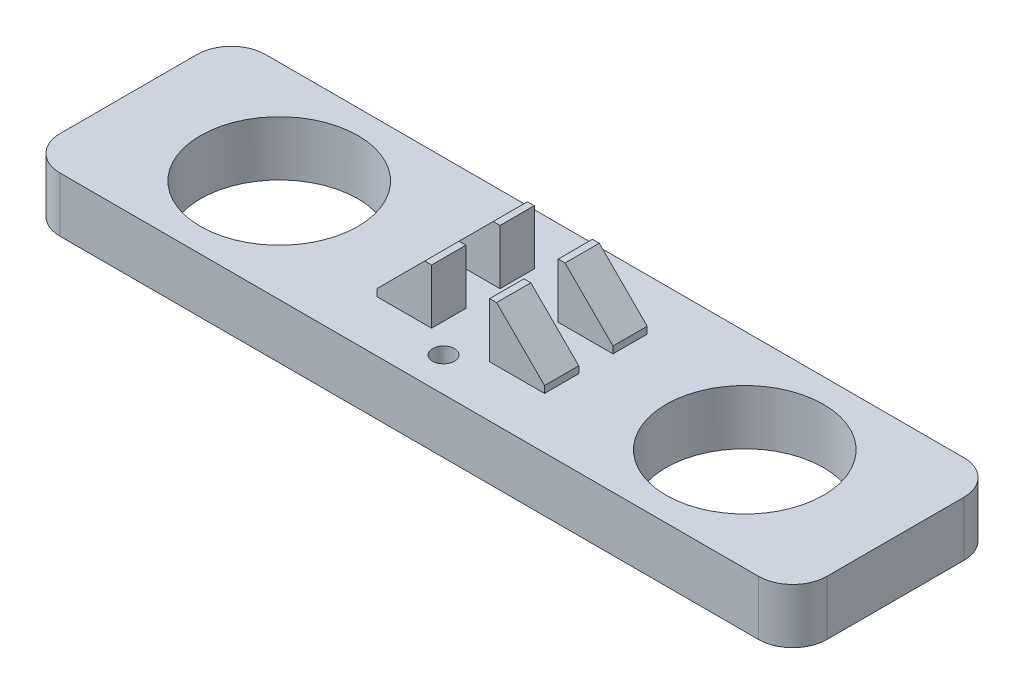
ISO-10303-21;
HEADER;
FILE_DESCRIPTION(('STEP AP214'),'2;1');
FILE_NAME('part.step','',(''),(''),'','','');
FILE_SCHEMA(('AUTOMOTIVE_DESIGN { 1 0 10303 214 1 1 1 1 }'));
ENDSEC;
DATA;
#1=APPLICATION_CONTEXT('core data for automotive mechanical design processes');
#2=APPLICATION_PROTOCOL_DEFINITION('international standard','automotive_design',2000,#1);
#3=PRODUCT_CONTEXT('',#1,'mechanical');
#4=PRODUCT('Part','Part','',(#3));
#5=PRODUCT_RELATED_PRODUCT_CATEGORY('part','',(#4));
#6=PRODUCT_DEFINITION_FORMATION('','',#4);
#7=PRODUCT_DEFINITION_CONTEXT('part definition',#1,'design');
#8=PRODUCT_DEFINITION('design','',#6,#7);
#9=PRODUCT_DEFINITION_SHAPE('','',#8);
#10=(LENGTH_UNIT() NAMED_UNIT(*) SI_UNIT(.MILLI.,.METRE.));
#11=(NAMED_UNIT(*) PLANE_ANGLE_UNIT() SI_UNIT($,.RADIAN.));
#12=(NAMED_UNIT(*) SI_UNIT($,.STERADIAN.) SOLID_ANGLE_UNIT());
#13=UNCERTAINTY_MEASURE_WITH_UNIT(LENGTH_MEASURE(1.E-05),#10,'distance_accuracy_value','');
#14=(GEOMETRIC_REPRESENTATION_CONTEXT(3) GLOBAL_UNCERTAINTY_ASSIGNED_CONTEXT((#13)) GLOBAL_UNIT_ASSIGNED_CONTEXT((#10,
#11,#12)) REPRESENTATION_CONTEXT('',''));
#15=CARTESIAN_POINT('',(0.,0.,0.));
#16=DIRECTION('',(0.,0.,1.));
#17=DIRECTION('',(1.,0.,0.));
#18=AXIS2_PLACEMENT_3D('',#15,#16,#17);
#19=CARTESIAN_POINT('',(0.,5.,0.));
#20=DIRECTION('',(0.,-1.,0.));
#21=DIRECTION('',(0.,0.,-1.));
#22=AXIS2_PLACEMENT_3D('',#19,#20,#21);
#23=PLANE('',#22);
#24=DIRECTION('',(-1.,0.,0.));
#25=VECTOR('',#24,1.);
#26=CARTESIAN_POINT('',(60.25,5.,-7.5));
#27=LINE('',#26,#25);
#28=CARTESIAN_POINT('',(68.25,5.,-7.5));
#29=VERTEX_POINT('',#28);
#30=CARTESIAN_POINT('',(60.25,5.,-7.5));
#31=VERTEX_POINT('',#30);
#32=EDGE_CURVE('E256',#29,#31,#27,.T.);
#33=ORIENTED_EDGE('',*,*,#32,.T.);
#34=DIRECTION('',(0.,0.,-1.));
#35=VECTOR('',#34,1.);
#36=CARTESIAN_POINT('',(60.25,5.,-7.5));
#37=LINE('',#36,#35);
#38=CARTESIAN_POINT('',(60.25,5.,-12.5));
#39=VERTEX_POINT('',#38);
#40=EDGE_CURVE('E240',#31,#39,#37,.T.);
#41=ORIENTED_EDGE('',*,*,#40,.T.);
#42=DIRECTION('',(1.,0.,0.));
#43=VECTOR('',#42,1.);
#44=CARTESIAN_POINT('',(60.25,5.,-12.5));
#45=LINE('',#44,#43);
#46=CARTESIAN_POINT('',(68.25,5.,-12.5));
#47=VERTEX_POINT('',#46);
#48=EDGE_CURVE('E247',#39,#47,#45,.T.);
#49=ORIENTED_EDGE('',*,*,#48,.T.);
#50=DIRECTION('',(0.,0.,1.));
#51=VECTOR('',#50,1.);
#52=CARTESIAN_POINT('',(68.25,5.,-7.5));
#53=LINE('',#52,#51);
#54=EDGE_CURVE('E250',#47,#29,#53,.T.);
#55=ORIENTED_EDGE('',*,*,#54,.T.);
#56=EDGE_LOOP('',(#33,#41,#49,#55));
#57=FACE_BOUND('',#56,.T.);
#58=DIRECTION('',(-1.,0.,0.));
#59=VECTOR('',#58,1.);
#60=CARTESIAN_POINT('',(43.75,5.,-7.5));
#61=LINE('',#60,#59);
#62=CARTESIAN_POINT('',(51.75,5.,-7.5));
#63=VERTEX_POINT('',#62);
#64=CARTESIAN_POINT('',(43.75,5.,-7.5));
#65=VERTEX_POINT('',#64);
#66=EDGE_CURVE('E275',#63,#65,#61,.T.);
#67=ORIENTED_EDGE('',*,*,#66,.T.);
#68=DIRECTION('',(0.,0.,-1.));
#69=VECTOR('',#68,1.);
#70=CARTESIAN_POINT('',(43.75,5.,-7.5));
#71=LINE('',#70,#69);
#72=CARTESIAN_POINT('',(43.75,5.,-12.5));
#73=VERTEX_POINT('',#72);
#74=EDGE_CURVE('E242',#65,#73,#71,.T.);
#75=ORIENTED_EDGE('',*,*,#74,.T.);
#76=DIRECTION('',(1.,0.,0.));
#77=VECTOR('',#76,1.);
#78=CARTESIAN_POINT('',(43.75,5.,-12.5));
#79=LINE('',#78,#77);
#80=CARTESIAN_POINT('',(51.75,5.,-12.5));
#81=VERTEX_POINT('',#80);
#82=EDGE_CURVE('E267',#73,#81,#79,.T.);
#83=ORIENTED_EDGE('',*,*,#82,.T.);
#84=DIRECTION('',(0.,0.,1.));
#85=VECTOR('',#84,1.);
#86=CARTESIAN_POINT('',(51.75,5.,-7.5));
#87=LINE('',#86,#85);
#88=EDGE_CURVE('E278',#81,#63,#87,.T.);
#89=ORIENTED_EDGE('',*,*,#88,.T.);
#90=EDGE_LOOP('',(#67,#75,#83,#89));
#91=FACE_BOUND('',#90,.T.);
#92=DIRECTION('',(0.,0.,1.));
#93=VECTOR('',#92,1.);
#94=CARTESIAN_POINT('',(43.75,5.,-22.5));
#95=LINE('',#94,#93);
#96=CARTESIAN_POINT('',(43.75,5.,-22.5));
#97=VERTEX_POINT('',#96);
#98=CARTESIAN_POINT('',(43.75,5.,-17.5));
#99=VERTEX_POINT('',#98);
#100=EDGE_CURVE('E321',#97,#99,#95,.T.);
#101=ORIENTED_EDGE('',*,*,#100,.F.);
#102=DIRECTION('',(-1.,0.,0.));
#103=VECTOR('',#102,1.);
#104=CARTESIAN_POINT('',(43.75,5.,-22.5));
#105=LINE('',#104,#103);
#106=CARTESIAN_POINT('',(51.75,5.,-22.5));
#107=VERTEX_POINT('',#106);
#108=EDGE_CURVE('E325',#107,#97,#105,.T.);
#109=ORIENTED_EDGE('',*,*,#108,.F.);
#110=DIRECTION('',(0.,0.,-1.));
#111=VECTOR('',#110,1.);
#112=CARTESIAN_POINT('',(51.75,5.,-22.5));
#113=LINE('',#112,#111);
#114=CARTESIAN_POINT('',(51.75,5.,-17.5));
#115=VERTEX_POINT('',#114);
#116=EDGE_CURVE('E336',#115,#107,#113,.T.);
#117=ORIENTED_EDGE('',*,*,#116,.F.);
#118=DIRECTION('',(1.,0.,0.));
#119=VECTOR('',#118,1.);
#120=CARTESIAN_POINT('',(43.75,5.,-17.5));
#121=LINE('',#120,#119);
#122=EDGE_CURVE('E333',#99,#115,#121,.T.);
#123=ORIENTED_EDGE('',*,*,#122,.F.);
#124=EDGE_LOOP('',(#101,#109,#117,#123));
#125=FACE_BOUND('',#124,.T.);
#126=CARTESIAN_POINT('',(56.,5.,-25.));
#127=DIRECTION('',(0.,-1.,0.));
#128=DIRECTION('',(0.,0.,1.));
#129=AXIS2_PLACEMENT_3D('',#126,#127,#128);
#130=CIRCLE('',#129,1.6);
#131=CARTESIAN_POINT('',(56.,5.,-23.4));
#132=VERTEX_POINT('',#131);
#133=EDGE_CURVE('E363',#132,#132,#130,.T.);
#134=ORIENTED_EDGE('',*,*,#133,.T.);
#135=EDGE_LOOP('',(#134));
#136=FACE_BOUND('',#135,.T.);
#137=CARTESIAN_POINT('',(56.,5.,-5.));
#138=DIRECTION('',(0.,-1.,0.));
#139=DIRECTION('',(0.,0.,1.));
#140=AXIS2_PLACEMENT_3D('',#137,#138,#139);
#141=CIRCLE('',#140,1.6);
#142=CARTESIAN_POINT('',(56.,5.,-3.4));
#143=VERTEX_POINT('',#142);
#144=EDGE_CURVE('E362',#143,#143,#141,.T.);
#145=ORIENTED_EDGE('',*,*,#144,.T.);
#146=EDGE_LOOP('',(#145));
#147=FACE_BOUND('',#146,.T.);
#148=DIRECTION('',(1.,0.,0.));
#149=VECTOR('',#148,1.);
#150=CARTESIAN_POINT('',(0.,5.,0.));
#151=LINE('',#150,#149);
#152=CARTESIAN_POINT('',(5.,5.,0.));
#153=VERTEX_POINT('',#152);
#154=CARTESIAN_POINT('',(107.,5.,0.));
#155=VERTEX_POINT('',#154);
#156=EDGE_CURVE('E402',#153,#155,#151,.T.);
#157=ORIENTED_EDGE('',*,*,#156,.T.);
#158=CARTESIAN_POINT('',(107.,5.,-5.));
#159=DIRECTION('',(0.,-1.,0.));
#160=DIRECTION('',(0.,0.,-1.));
#161=AXIS2_PLACEMENT_3D('',#158,#159,#160);
#162=CIRCLE('',#161,5.);
#163=CARTESIAN_POINT('',(112.,5.,-5.));
#164=VERTEX_POINT('',#163);
#165=EDGE_CURVE('E429',#155,#164,#162,.F.);
#166=ORIENTED_EDGE('',*,*,#165,.T.);
#167=DIRECTION('',(0.,0.,1.));
#168=VECTOR('',#167,1.);
#169=CARTESIAN_POINT('',(112.,5.,0.));
#170=LINE('',#169,#168);
#171=CARTESIAN_POINT('',(112.,5.,-25.));
#172=VERTEX_POINT('',#171);
#173=EDGE_CURVE('E371',#172,#164,#170,.T.);
#174=ORIENTED_EDGE('',*,*,#173,.F.);
#175=CARTESIAN_POINT('',(107.,5.,-25.));
#176=DIRECTION('',(0.,-1.,0.));
#177=DIRECTION('',(0.,0.,-1.));
#178=AXIS2_PLACEMENT_3D('',#175,#176,#177);
#179=CIRCLE('',#178,5.);
#180=CARTESIAN_POINT('',(107.,5.,-30.));
#181=VERTEX_POINT('',#180);
#182=EDGE_CURVE('E427',#172,#181,#179,.F.);
#183=ORIENTED_EDGE('',*,*,#182,.T.);
#184=DIRECTION('',(-1.,0.,0.));
#185=VECTOR('',#184,1.);
#186=CARTESIAN_POINT('',(0.,5.,-30.));
#187=LINE('',#186,#185);
#188=CARTESIAN_POINT('',(5.,5.,-30.));
#189=VERTEX_POINT('',#188);
#190=EDGE_CURVE('E405',#181,#189,#187,.T.);
#191=ORIENTED_EDGE('',*,*,#190,.T.);
#192=CARTESIAN_POINT('',(5.,5.,-25.));
#193=DIRECTION('',(0.,-1.,0.));
#194=DIRECTION('',(0.,0.,-1.));
#195=AXIS2_PLACEMENT_3D('',#192,#193,#194);
#196=CIRCLE('',#195,5.);
#197=CARTESIAN_POINT('',(0.,5.,-25.));
#198=VERTEX_POINT('',#197);
#199=EDGE_CURVE('E414',#189,#198,#196,.F.);
#200=ORIENTED_EDGE('',*,*,#199,.T.);
#201=DIRECTION('',(0.,0.,1.));
#202=VECTOR('',#201,1.);
#203=CARTESIAN_POINT('',(0.,5.,0.));
#204=LINE('',#203,#202);
#205=CARTESIAN_POINT('',(0.,5.,-5.));
#206=VERTEX_POINT('',#205);
#207=EDGE_CURVE('E399',#198,#206,#204,.T.);
#208=ORIENTED_EDGE('',*,*,#207,.T.);
#209=CARTESIAN_POINT('',(5.,5.,-5.));
#210=DIRECTION('',(0.,-1.,0.));
#211=DIRECTION('',(0.,0.,-1.));
#212=AXIS2_PLACEMENT_3D('',#209,#210,#211);
#213=CIRCLE('',#212,5.);
#214=EDGE_CURVE('E416',#206,#153,#213,.F.);
#215=ORIENTED_EDGE('',*,*,#214,.T.);
#216=EDGE_LOOP('',(#157,#166,#174,#183,#191,#200,#208,#215));
#217=FACE_BOUND('',#216,.T.);
#218=CARTESIAN_POINT('',(22.,5.,-15.));
#219=DIRECTION('',(0.,1.,0.));
#220=DIRECTION('',(0.,0.,1.));
#221=AXIS2_PLACEMENT_3D('',#218,#219,#220);
#222=CIRCLE('',#221,11.5);
#223=CARTESIAN_POINT('',(22.,5.,-3.5));
#224=VERTEX_POINT('',#223);
#225=EDGE_CURVE('E396',#224,#224,#222,.T.);
#226=ORIENTED_EDGE('',*,*,#225,.F.);
#227=EDGE_LOOP('',(#226));
#228=FACE_BOUND('',#227,.T.);
#229=CARTESIAN_POINT('',(90.,5.,-15.));
#230=DIRECTION('',(0.,-1.,0.));
#231=DIRECTION('',(0.,0.,1.));
#232=AXIS2_PLACEMENT_3D('',#229,#230,#231);
#233=CIRCLE('',#232,11.5);
#234=CARTESIAN_POINT('',(90.,5.,-3.5));
#235=VERTEX_POINT('',#234);
#236=EDGE_CURVE('E366',#235,#235,#233,.T.);
#237=ORIENTED_EDGE('',*,*,#236,.T.);
#238=EDGE_LOOP('',(#237));
#239=FACE_BOUND('',#238,.T.);
#240=DIRECTION('',(0.,0.,1.));
#241=VECTOR('',#240,1.);
#242=CARTESIAN_POINT('',(60.25,5.,-22.5));
#243=LINE('',#242,#241);
#244=CARTESIAN_POINT('',(60.25,5.,-22.5));
#245=VERTEX_POINT('',#244);
#246=CARTESIAN_POINT('',(60.25,5.,-17.5));
#247=VERTEX_POINT('',#246);
#248=EDGE_CURVE('E291',#245,#247,#243,.T.);
#249=ORIENTED_EDGE('',*,*,#248,.F.);
#250=DIRECTION('',(-1.,0.,0.));
#251=VECTOR('',#250,1.);
#252=CARTESIAN_POINT('',(60.25,5.,-22.5));
#253=LINE('',#252,#251);
#254=CARTESIAN_POINT('',(68.25,5.,-22.5));
#255=VERTEX_POINT('',#254);
#256=EDGE_CURVE('E296',#255,#245,#253,.T.);
#257=ORIENTED_EDGE('',*,*,#256,.F.);
#258=DIRECTION('',(0.,0.,-1.));
#259=VECTOR('',#258,1.);
#260=CARTESIAN_POINT('',(68.25,5.,-22.5));
#261=LINE('',#260,#259);
#262=CARTESIAN_POINT('',(68.25,5.,-17.5));
#263=VERTEX_POINT('',#262);
#264=EDGE_CURVE('E307',#263,#255,#261,.T.);
#265=ORIENTED_EDGE('',*,*,#264,.F.);
#266=DIRECTION('',(1.,0.,0.));
#267=VECTOR('',#266,1.);
#268=CARTESIAN_POINT('',(60.25,5.,-17.5));
#269=LINE('',#268,#267);
#270=EDGE_CURVE('E304',#247,#263,#269,.T.);
#271=ORIENTED_EDGE('',*,*,#270,.F.);
#272=EDGE_LOOP('',(#249,#257,#265,#271));
#273=FACE_BOUND('',#272,.T.);
#274=ADVANCED_FACE('F37',(#57,#91,#125,#136,#147,#217,#228,#239,#273),#23,.F.);
#275=CARTESIAN_POINT('',(0.,5.,0.));
#276=DIRECTION('',(1.,0.,0.));
#277=DIRECTION('',(0.,0.,-1.));
#278=AXIS2_PLACEMENT_3D('',#275,#276,#277);
#279=PLANE('',#278);
#280=DIRECTION('',(0.,-1.,0.));
#281=VECTOR('',#280,1.);
#282=CARTESIAN_POINT('',(0.,5.,-25.));
#283=LINE('',#282,#281);
#284=CARTESIAN_POINT('',(0.,-3.,-25.));
#285=VERTEX_POINT('',#284);
#286=EDGE_CURVE('E410',#198,#285,#283,.T.);
#287=ORIENTED_EDGE('',*,*,#286,.T.);
#288=DIRECTION('',(0.,0.,-1.));
#289=VECTOR('',#288,1.);
#290=CARTESIAN_POINT('',(0.,-3.,0.));
#291=LINE('',#290,#289);
#292=CARTESIAN_POINT('',(0.,-3.,-5.));
#293=VERTEX_POINT('',#292);
#294=EDGE_CURVE('E385',#293,#285,#291,.T.);
#295=ORIENTED_EDGE('',*,*,#294,.F.);
#296=DIRECTION('',(0.,-1.,0.));
#297=VECTOR('',#296,1.);
#298=CARTESIAN_POINT('',(0.,5.,-5.));
#299=LINE('',#298,#297);
#300=EDGE_CURVE('E412',#293,#206,#299,.F.);
#301=ORIENTED_EDGE('',*,*,#300,.T.);
#302=ORIENTED_EDGE('',*,*,#207,.F.);
#303=EDGE_LOOP('',(#287,#295,#301,#302));
#304=FACE_BOUND('',#303,.T.);
#305=ADVANCED_FACE('F485',(#304),#279,.F.);
#306=CARTESIAN_POINT('',(0.,5.,0.));
#307=DIRECTION('',(0.,0.,-1.));
#308=DIRECTION('',(-1.,0.,0.));
#309=AXIS2_PLACEMENT_3D('',#306,#307,#308);
#310=PLANE('',#309);
#311=DIRECTION('',(0.,-1.,0.));
#312=VECTOR('',#311,1.);
#313=CARTESIAN_POINT('',(5.,5.,0.));
#314=LINE('',#313,#312);
#315=CARTESIAN_POINT('',(5.,-3.,0.));
#316=VERTEX_POINT('',#315);
#317=EDGE_CURVE('E407',#153,#316,#314,.T.);
#318=ORIENTED_EDGE('',*,*,#317,.T.);
#319=DIRECTION('',(-1.,0.,0.));
#320=VECTOR('',#319,1.);
#321=CARTESIAN_POINT('',(0.,-3.,0.));
#322=LINE('',#321,#320);
#323=CARTESIAN_POINT('',(107.,-3.,0.));
#324=VERTEX_POINT('',#323);
#325=EDGE_CURVE('E380',#324,#316,#322,.T.);
#326=ORIENTED_EDGE('',*,*,#325,.F.);
#327=DIRECTION('',(0.,-1.,0.));
#328=VECTOR('',#327,1.);
#329=CARTESIAN_POINT('',(107.,5.,0.));
#330=LINE('',#329,#328);
#331=EDGE_CURVE('E425',#324,#155,#330,.F.);
#332=ORIENTED_EDGE('',*,*,#331,.T.);
#333=ORIENTED_EDGE('',*,*,#156,.F.);
#334=EDGE_LOOP('',(#318,#326,#332,#333));
#335=FACE_BOUND('',#334,.T.);
#336=ADVANCED_FACE('F491',(#335),#310,.F.);
#337=CARTESIAN_POINT('',(0.,5.,-30.));
#338=DIRECTION('',(0.,0.,1.));
#339=DIRECTION('',(1.,0.,0.));
#340=AXIS2_PLACEMENT_3D('',#337,#338,#339);
#341=PLANE('',#340);
#342=DIRECTION('',(0.,-1.,0.));
#343=VECTOR('',#342,1.);
#344=CARTESIAN_POINT('',(107.,0.,-30.));
#345=LINE('',#344,#343);
#346=CARTESIAN_POINT('',(107.,-3.,-30.));
#347=VERTEX_POINT('',#346);
#348=EDGE_CURVE('E431',#181,#347,#345,.T.);
#349=ORIENTED_EDGE('',*,*,#348,.T.);
#350=DIRECTION('',(1.,0.,0.));
#351=VECTOR('',#350,1.);
#352=CARTESIAN_POINT('',(0.,-3.,-30.));
#353=LINE('',#352,#351);
#354=CARTESIAN_POINT('',(5.,-3.,-30.));
#355=VERTEX_POINT('',#354);
#356=EDGE_CURVE('E391',#355,#347,#353,.T.);
#357=ORIENTED_EDGE('',*,*,#356,.F.);
#358=DIRECTION('',(0.,-1.,0.));
#359=VECTOR('',#358,1.);
#360=CARTESIAN_POINT('',(5.,5.,-30.));
#361=LINE('',#360,#359);
#362=EDGE_CURVE('E418',#355,#189,#361,.F.);
#363=ORIENTED_EDGE('',*,*,#362,.T.);
#364=ORIENTED_EDGE('',*,*,#190,.F.);
#365=EDGE_LOOP('',(#349,#357,#363,#364));
#366=FACE_BOUND('',#365,.T.);
#367=ADVANCED_FACE('F498',(#366),#341,.F.);
#368=CARTESIAN_POINT('',(22.,5.,-15.));
#369=DIRECTION('',(0.,-1.,0.));
#370=DIRECTION('',(0.,0.,-1.));
#371=AXIS2_PLACEMENT_3D('',#368,#369,#370);
#372=CYLINDRICAL_SURFACE('',#371,11.5);
#373=ORIENTED_EDGE('',*,*,#225,.T.);
#374=EDGE_LOOP('',(#373));
#375=FACE_BOUND('',#374,.T.);
#376=CARTESIAN_POINT('',(22.,-3.,-15.));
#377=DIRECTION('',(0.,-1.,0.));
#378=DIRECTION('',(0.,0.,-1.));
#379=AXIS2_PLACEMENT_3D('',#376,#377,#378);
#380=CIRCLE('',#379,11.5);
#381=CARTESIAN_POINT('',(22.,-3.,-26.5));
#382=VERTEX_POINT('',#381);
#383=EDGE_CURVE('E377',#382,#382,#380,.F.);
#384=ORIENTED_EDGE('',*,*,#383,.F.);
#385=EDGE_LOOP('',(#384));
#386=FACE_BOUND('',#385,.T.);
#387=ADVANCED_FACE('F496',(#375,#386),#372,.F.);
#388=CARTESIAN_POINT('',(56.,0.,-5.));
#389=DIRECTION('',(0.,1.,0.));
#390=DIRECTION('',(0.,0.,1.));
#391=AXIS2_PLACEMENT_3D('',#388,#389,#390);
#392=CYLINDRICAL_SURFACE('',#391,1.6);
#393=CARTESIAN_POINT('',(56.,-3.,-5.));
#394=DIRECTION('',(0.,-1.,0.));
#395=DIRECTION('',(0.,0.,-1.));
#396=AXIS2_PLACEMENT_3D('',#393,#394,#395);
#397=CIRCLE('',#396,1.6);
#398=CARTESIAN_POINT('',(56.,-3.,-6.6));
#399=VERTEX_POINT('',#398);
#400=EDGE_CURVE('E374',#399,#399,#397,.F.);
#401=ORIENTED_EDGE('',*,*,#400,.F.);
#402=EDGE_LOOP('',(#401));
#403=FACE_BOUND('',#402,.T.);
#404=ORIENTED_EDGE('',*,*,#144,.F.);
#405=EDGE_LOOP('',(#404));
#406=FACE_BOUND('',#405,.T.);
#407=ADVANCED_FACE('F591',(#403,#406),#392,.F.);
#408=CARTESIAN_POINT('',(56.,0.,-25.));
#409=DIRECTION('',(0.,1.,0.));
#410=DIRECTION('',(0.,0.,1.));
#411=AXIS2_PLACEMENT_3D('',#408,#409,#410);
#412=CYLINDRICAL_SURFACE('',#411,1.6);
#413=CARTESIAN_POINT('',(56.,-3.,-25.));
#414=DIRECTION('',(0.,-1.,0.));
#415=DIRECTION('',(0.,0.,-1.));
#416=AXIS2_PLACEMENT_3D('',#413,#414,#415);
#417=CIRCLE('',#416,1.6);
#418=CARTESIAN_POINT('',(56.,-3.,-26.6));
#419=VERTEX_POINT('',#418);
#420=EDGE_CURVE('E393',#419,#419,#417,.F.);
#421=ORIENTED_EDGE('',*,*,#420,.F.);
#422=EDGE_LOOP('',(#421));
#423=FACE_BOUND('',#422,.T.);
#424=ORIENTED_EDGE('',*,*,#133,.F.);
#425=EDGE_LOOP('',(#424));
#426=FACE_BOUND('',#425,.T.);
#427=ADVANCED_FACE('F509',(#423,#426),#412,.F.);
#428=CARTESIAN_POINT('',(5.,5.,-5.));
#429=DIRECTION('',(0.,-1.,0.));
#430=DIRECTION('',(0.,0.,-1.));
#431=AXIS2_PLACEMENT_3D('',#428,#429,#430);
#432=CYLINDRICAL_SURFACE('',#431,5.);
#433=ORIENTED_EDGE('',*,*,#214,.F.);
#434=ORIENTED_EDGE('',*,*,#300,.F.);
#435=CARTESIAN_POINT('',(5.,-3.,-5.));
#436=DIRECTION('',(0.,-1.,0.));
#437=DIRECTION('',(0.,0.,-1.));
#438=AXIS2_PLACEMENT_3D('',#435,#436,#437);
#439=CIRCLE('',#438,5.);
#440=EDGE_CURVE('E382',#316,#293,#439,.T.);
#441=ORIENTED_EDGE('',*,*,#440,.F.);
#442=ORIENTED_EDGE('',*,*,#317,.F.);
#443=EDGE_LOOP('',(#433,#434,#441,#442));
#444=FACE_BOUND('',#443,.T.);
#445=ADVANCED_FACE('F505',(#444),#432,.T.);
#446=CARTESIAN_POINT('',(5.,5.,-25.));
#447=DIRECTION('',(0.,-1.,0.));
#448=DIRECTION('',(0.,0.,-1.));
#449=AXIS2_PLACEMENT_3D('',#446,#447,#448);
#450=CYLINDRICAL_SURFACE('',#449,5.);
#451=ORIENTED_EDGE('',*,*,#199,.F.);
#452=ORIENTED_EDGE('',*,*,#362,.F.);
#453=CARTESIAN_POINT('',(5.,-3.,-25.));
#454=DIRECTION('',(0.,-1.,0.));
#455=DIRECTION('',(0.,0.,-1.));
#456=AXIS2_PLACEMENT_3D('',#453,#454,#455);
#457=CIRCLE('',#456,5.);
#458=EDGE_CURVE('E388',#285,#355,#457,.T.);
#459=ORIENTED_EDGE('',*,*,#458,.F.);
#460=ORIENTED_EDGE('',*,*,#286,.F.);
#461=EDGE_LOOP('',(#451,#452,#459,#460));
#462=FACE_BOUND('',#461,.T.);
#463=ADVANCED_FACE('F508',(#462),#450,.T.);
#464=CARTESIAN_POINT('',(0.,-3.,0.));
#465=DIRECTION('',(0.,-1.,0.));
#466=DIRECTION('',(0.,0.,-1.));
#467=AXIS2_PLACEMENT_3D('',#464,#465,#466);
#468=PLANE('',#467);
#469=ORIENTED_EDGE('',*,*,#356,.T.);
#470=CARTESIAN_POINT('',(107.,-3.,-25.));
#471=DIRECTION('',(0.,1.,0.));
#472=DIRECTION('',(0.,0.,-1.));
#473=AXIS2_PLACEMENT_3D('',#470,#471,#472);
#474=CIRCLE('',#473,5.);
#475=CARTESIAN_POINT('',(112.,-3.,-25.));
#476=VERTEX_POINT('',#475);
#477=EDGE_CURVE('E353',#476,#347,#474,.T.);
#478=ORIENTED_EDGE('',*,*,#477,.F.);
#479=DIRECTION('',(0.,0.,-1.));
#480=VECTOR('',#479,1.);
#481=CARTESIAN_POINT('',(112.,-3.,0.));
#482=LINE('',#481,#480);
#483=CARTESIAN_POINT('',(112.,-3.,-5.));
#484=VERTEX_POINT('',#483);
#485=EDGE_CURVE('E356',#484,#476,#482,.T.);
#486=ORIENTED_EDGE('',*,*,#485,.F.);
#487=CARTESIAN_POINT('',(107.,-3.,-5.));
#488=DIRECTION('',(0.,1.,0.));
#489=DIRECTION('',(0.,0.,-1.));
#490=AXIS2_PLACEMENT_3D('',#487,#488,#489);
#491=CIRCLE('',#490,5.);
#492=EDGE_CURVE('E359',#324,#484,#491,.T.);
#493=ORIENTED_EDGE('',*,*,#492,.F.);
#494=ORIENTED_EDGE('',*,*,#325,.T.);
#495=ORIENTED_EDGE('',*,*,#440,.T.);
#496=ORIENTED_EDGE('',*,*,#294,.T.);
#497=ORIENTED_EDGE('',*,*,#458,.T.);
#498=EDGE_LOOP('',(#469,#478,#486,#493,#494,#495,#496,#497));
#499=FACE_BOUND('',#498,.T.);
#500=ORIENTED_EDGE('',*,*,#383,.T.);
#501=EDGE_LOOP('',(#500));
#502=FACE_BOUND('',#501,.T.);
#503=ORIENTED_EDGE('',*,*,#420,.T.);
#504=EDGE_LOOP('',(#503));
#505=FACE_BOUND('',#504,.T.);
#506=ORIENTED_EDGE('',*,*,#400,.T.);
#507=EDGE_LOOP('',(#506));
#508=FACE_BOUND('',#507,.T.);
#509=CARTESIAN_POINT('',(90.,-3.,-15.));
#510=DIRECTION('',(0.,1.,0.));
#511=DIRECTION('',(0.,0.,-1.));
#512=AXIS2_PLACEMENT_3D('',#509,#510,#511);
#513=CIRCLE('',#512,11.5);
#514=CARTESIAN_POINT('',(90.,-3.,-26.5));
#515=VERTEX_POINT('',#514);
#516=EDGE_CURVE('E350',#515,#515,#513,.F.);
#517=ORIENTED_EDGE('',*,*,#516,.F.);
#518=EDGE_LOOP('',(#517));
#519=FACE_BOUND('',#518,.T.);
#520=ADVANCED_FACE('F513',(#499,#502,#505,#508,#519),#468,.T.);
#521=CARTESIAN_POINT('',(112.,5.,0.));
#522=DIRECTION('',(1.,0.,0.));
#523=DIRECTION('',(0.,0.,-1.));
#524=AXIS2_PLACEMENT_3D('',#521,#522,#523);
#525=PLANE('',#524);
#526=ORIENTED_EDGE('',*,*,#173,.T.);
#527=DIRECTION('',(0.,-1.,0.));
#528=VECTOR('',#527,1.);
#529=CARTESIAN_POINT('',(112.,0.,-5.));
#530=LINE('',#529,#528);
#531=EDGE_CURVE('E423',#164,#484,#530,.T.);
#532=ORIENTED_EDGE('',*,*,#531,.T.);
#533=ORIENTED_EDGE('',*,*,#485,.T.);
#534=DIRECTION('',(0.,-1.,0.));
#535=VECTOR('',#534,1.);
#536=CARTESIAN_POINT('',(112.,5.,-25.));
#537=LINE('',#536,#535);
#538=EDGE_CURVE('E421',#476,#172,#537,.F.);
#539=ORIENTED_EDGE('',*,*,#538,.T.);
#540=EDGE_LOOP('',(#526,#532,#533,#539));
#541=FACE_BOUND('',#540,.T.);
#542=ADVANCED_FACE('F582',(#541),#525,.T.);
#543=CARTESIAN_POINT('',(90.,5.,-15.));
#544=DIRECTION('',(0.,-1.,0.));
#545=DIRECTION('',(0.,0.,-1.));
#546=AXIS2_PLACEMENT_3D('',#543,#544,#545);
#547=CYLINDRICAL_SURFACE('',#546,11.5);
#548=ORIENTED_EDGE('',*,*,#236,.F.);
#549=EDGE_LOOP('',(#548));
#550=FACE_BOUND('',#549,.T.);
#551=ORIENTED_EDGE('',*,*,#516,.T.);
#552=EDGE_LOOP('',(#551));
#553=FACE_BOUND('',#552,.T.);
#554=ADVANCED_FACE('F519',(#550,#553),#547,.F.);
#555=CARTESIAN_POINT('',(107.,5.,-5.));
#556=DIRECTION('',(0.,1.,0.));
#557=DIRECTION('',(0.,0.,1.));
#558=AXIS2_PLACEMENT_3D('',#555,#556,#557);
#559=CYLINDRICAL_SURFACE('',#558,5.);
#560=ORIENTED_EDGE('',*,*,#165,.F.);
#561=ORIENTED_EDGE('',*,*,#331,.F.);
#562=ORIENTED_EDGE('',*,*,#492,.T.);
#563=ORIENTED_EDGE('',*,*,#531,.F.);
#564=EDGE_LOOP('',(#560,#561,#562,#563));
#565=FACE_BOUND('',#564,.T.);
#566=ADVANCED_FACE('F515',(#565),#559,.T.);
#567=CARTESIAN_POINT('',(107.,5.,-25.));
#568=DIRECTION('',(0.,1.,0.));
#569=DIRECTION('',(0.,0.,1.));
#570=AXIS2_PLACEMENT_3D('',#567,#568,#569);
#571=CYLINDRICAL_SURFACE('',#570,5.);
#572=ORIENTED_EDGE('',*,*,#182,.F.);
#573=ORIENTED_EDGE('',*,*,#538,.F.);
#574=ORIENTED_EDGE('',*,*,#477,.T.);
#575=ORIENTED_EDGE('',*,*,#348,.F.);
#576=EDGE_LOOP('',(#572,#573,#574,#575));
#577=FACE_BOUND('',#576,.T.);
#578=ADVANCED_FACE('F518',(#577),#571,.T.);
#579=CARTESIAN_POINT('',(43.75,13.,-22.5));
#580=DIRECTION('',(1.,0.,0.));
#581=DIRECTION('',(0.,0.,-1.));
#582=AXIS2_PLACEMENT_3D('',#579,#580,#581);
#583=PLANE('',#582);
#584=DIRECTION('',(0.,-1.,0.));
#585=VECTOR('',#584,1.);
#586=CARTESIAN_POINT('',(43.75,13.,-17.5));
#587=LINE('',#586,#585);
#588=CARTESIAN_POINT('',(43.75,5.99999999999999,-17.5));
#589=VERTEX_POINT('',#588);
#590=EDGE_CURVE('E348',#589,#99,#587,.T.);
#591=ORIENTED_EDGE('',*,*,#590,.F.);
#592=DIRECTION('',(0.,0.,-1.));
#593=VECTOR('',#592,1.);
#594=CARTESIAN_POINT('',(43.75,5.99999999999999,-22.5));
#595=LINE('',#594,#593);
#596=CARTESIAN_POINT('',(43.75,5.99999999999999,-22.5));
#597=VERTEX_POINT('',#596);
#598=EDGE_CURVE('E448',#589,#597,#595,.T.);
#599=ORIENTED_EDGE('',*,*,#598,.T.);
#600=DIRECTION('',(0.,-1.,0.));
#601=VECTOR('',#600,1.);
#602=CARTESIAN_POINT('',(43.75,13.,-22.5));
#603=LINE('',#602,#601);
#604=EDGE_CURVE('E330',#597,#97,#603,.T.);
#605=ORIENTED_EDGE('',*,*,#604,.T.);
#606=ORIENTED_EDGE('',*,*,#100,.T.);
#607=EDGE_LOOP('',(#591,#599,#605,#606));
#608=FACE_BOUND('',#607,.T.);
#609=ADVANCED_FACE('F523',(#608),#583,.F.);
#610=CARTESIAN_POINT('',(43.75,13.,-17.5));
#611=DIRECTION('',(0.,0.,-1.));
#612=DIRECTION('',(-1.,0.,0.));
#613=AXIS2_PLACEMENT_3D('',#610,#611,#612);
#614=PLANE('',#613);
#615=DIRECTION('',(1.,0.,0.));
#616=VECTOR('',#615,1.);
#617=CARTESIAN_POINT('',(43.75,13.,-17.5));
#618=LINE('',#617,#616);
#619=CARTESIAN_POINT('',(50.75,13.,-17.5));
#620=VERTEX_POINT('',#619);
#621=CARTESIAN_POINT('',(51.75,13.,-17.5));
#622=VERTEX_POINT('',#621);
#623=EDGE_CURVE('E322',#620,#622,#618,.T.);
#624=ORIENTED_EDGE('',*,*,#623,.F.);
#625=DIRECTION('',(-0.707106781186546,-0.707106781186549,0.));
#626=VECTOR('',#625,1.);
#627=CARTESIAN_POINT('',(50.75,13.,-17.5));
#628=LINE('',#627,#626);
#629=EDGE_CURVE('E446',#620,#589,#628,.T.);
#630=ORIENTED_EDGE('',*,*,#629,.T.);
#631=ORIENTED_EDGE('',*,*,#590,.T.);
#632=ORIENTED_EDGE('',*,*,#122,.T.);
#633=DIRECTION('',(0.,-1.,0.));
#634=VECTOR('',#633,1.);
#635=CARTESIAN_POINT('',(51.75,13.,-17.5));
#636=LINE('',#635,#634);
#637=EDGE_CURVE('E345',#622,#115,#636,.T.);
#638=ORIENTED_EDGE('',*,*,#637,.F.);
#639=EDGE_LOOP('',(#624,#630,#631,#632,#638));
#640=FACE_BOUND('',#639,.T.);
#641=ADVANCED_FACE('F569',(#640),#614,.F.);
#642=CARTESIAN_POINT('',(51.75,13.,-22.5));
#643=DIRECTION('',(-1.,0.,0.));
#644=DIRECTION('',(0.,0.,1.));
#645=AXIS2_PLACEMENT_3D('',#642,#643,#644);
#646=PLANE('',#645);
#647=ORIENTED_EDGE('',*,*,#116,.T.);
#648=DIRECTION('',(0.,-1.,0.));
#649=VECTOR('',#648,1.);
#650=CARTESIAN_POINT('',(51.75,13.,-22.5));
#651=LINE('',#650,#649);
#652=CARTESIAN_POINT('',(51.75,13.,-22.5));
#653=VERTEX_POINT('',#652);
#654=EDGE_CURVE('E342',#653,#107,#651,.T.);
#655=ORIENTED_EDGE('',*,*,#654,.F.);
#656=DIRECTION('',(0.,0.,-1.));
#657=VECTOR('',#656,1.);
#658=CARTESIAN_POINT('',(51.75,13.,-22.5));
#659=LINE('',#658,#657);
#660=EDGE_CURVE('E324',#622,#653,#659,.T.);
#661=ORIENTED_EDGE('',*,*,#660,.F.);
#662=ORIENTED_EDGE('',*,*,#637,.T.);
#663=EDGE_LOOP('',(#647,#655,#661,#662));
#664=FACE_BOUND('',#663,.T.);
#665=ADVANCED_FACE('F562',(#664),#646,.F.);
#666=CARTESIAN_POINT('',(43.75,13.,-22.5));
#667=DIRECTION('',(0.,0.,1.));
#668=DIRECTION('',(1.,0.,0.));
#669=AXIS2_PLACEMENT_3D('',#666,#667,#668);
#670=PLANE('',#669);
#671=ORIENTED_EDGE('',*,*,#604,.F.);
#672=DIRECTION('',(0.707106781186546,0.707106781186549,0.));
#673=VECTOR('',#672,1.);
#674=CARTESIAN_POINT('',(50.75,13.,-22.5));
#675=LINE('',#674,#673);
#676=CARTESIAN_POINT('',(50.75,13.,-22.5));
#677=VERTEX_POINT('',#676);
#678=EDGE_CURVE('E450',#597,#677,#675,.T.);
#679=ORIENTED_EDGE('',*,*,#678,.T.);
#680=DIRECTION('',(-1.,0.,0.));
#681=VECTOR('',#680,1.);
#682=CARTESIAN_POINT('',(43.75,13.,-22.5));
#683=LINE('',#682,#681);
#684=EDGE_CURVE('E327',#653,#677,#683,.T.);
#685=ORIENTED_EDGE('',*,*,#684,.F.);
#686=ORIENTED_EDGE('',*,*,#654,.T.);
#687=ORIENTED_EDGE('',*,*,#108,.T.);
#688=EDGE_LOOP('',(#671,#679,#685,#686,#687));
#689=FACE_BOUND('',#688,.T.);
#690=ADVANCED_FACE('F554',(#689),#670,.F.);
#691=CARTESIAN_POINT('',(0.,13.,0.));
#692=DIRECTION('',(0.,1.,0.));
#693=DIRECTION('',(0.,0.,1.));
#694=AXIS2_PLACEMENT_3D('',#691,#692,#693);
#695=PLANE('',#694);
#696=ORIENTED_EDGE('',*,*,#684,.T.);
#697=DIRECTION('',(0.,0.,1.));
#698=VECTOR('',#697,1.);
#699=CARTESIAN_POINT('',(50.75,13.,-17.5));
#700=LINE('',#699,#698);
#701=EDGE_CURVE('E443',#677,#620,#700,.T.);
#702=ORIENTED_EDGE('',*,*,#701,.T.);
#703=ORIENTED_EDGE('',*,*,#623,.T.);
#704=ORIENTED_EDGE('',*,*,#660,.T.);
#705=EDGE_LOOP('',(#696,#702,#703,#704));
#706=FACE_BOUND('',#705,.T.);
#707=ADVANCED_FACE('F556',(#706),#695,.T.);
#708=CARTESIAN_POINT('',(60.25,13.,-22.5));
#709=DIRECTION('',(1.,0.,0.));
#710=DIRECTION('',(0.,0.,-1.));
#711=AXIS2_PLACEMENT_3D('',#708,#709,#710);
#712=PLANE('',#711);
#713=ORIENTED_EDGE('',*,*,#248,.T.);
#714=DIRECTION('',(0.,-1.,0.));
#715=VECTOR('',#714,1.);
#716=CARTESIAN_POINT('',(60.25,13.,-17.5));
#717=LINE('',#716,#715);
#718=CARTESIAN_POINT('',(60.25,13.,-17.5));
#719=VERTEX_POINT('',#718);
#720=EDGE_CURVE('E318',#719,#247,#717,.T.);
#721=ORIENTED_EDGE('',*,*,#720,.F.);
#722=DIRECTION('',(0.,0.,1.));
#723=VECTOR('',#722,1.);
#724=CARTESIAN_POINT('',(60.25,13.,-22.5));
#725=LINE('',#724,#723);
#726=CARTESIAN_POINT('',(60.25,13.,-22.5));
#727=VERTEX_POINT('',#726);
#728=EDGE_CURVE('E292',#727,#719,#725,.T.);
#729=ORIENTED_EDGE('',*,*,#728,.F.);
#730=DIRECTION('',(0.,-1.,0.));
#731=VECTOR('',#730,1.);
#732=CARTESIAN_POINT('',(60.25,13.,-22.5));
#733=LINE('',#732,#731);
#734=EDGE_CURVE('E301',#727,#245,#733,.T.);
#735=ORIENTED_EDGE('',*,*,#734,.T.);
#736=EDGE_LOOP('',(#713,#721,#729,#735));
#737=FACE_BOUND('',#736,.T.);
#738=ADVANCED_FACE('F621',(#737),#712,.F.);
#739=CARTESIAN_POINT('',(60.25,13.,-17.5));
#740=DIRECTION('',(0.,0.,-1.));
#741=DIRECTION('',(-1.,0.,0.));
#742=AXIS2_PLACEMENT_3D('',#739,#740,#741);
#743=PLANE('',#742);
#744=DIRECTION('',(0.,-1.,0.));
#745=VECTOR('',#744,1.);
#746=CARTESIAN_POINT('',(68.25,13.,-17.5));
#747=LINE('',#746,#745);
#748=CARTESIAN_POINT('',(68.25,5.99999999999999,-17.5));
#749=VERTEX_POINT('',#748);
#750=EDGE_CURVE('E316',#749,#263,#747,.T.);
#751=ORIENTED_EDGE('',*,*,#750,.F.);
#752=DIRECTION('',(-0.707106781186546,0.707106781186549,0.));
#753=VECTOR('',#752,1.);
#754=CARTESIAN_POINT('',(61.25,13.,-17.5));
#755=LINE('',#754,#753);
#756=CARTESIAN_POINT('',(61.25,13.,-17.5));
#757=VERTEX_POINT('',#756);
#758=EDGE_CURVE('E441',#749,#757,#755,.T.);
#759=ORIENTED_EDGE('',*,*,#758,.T.);
#760=DIRECTION('',(1.,0.,0.));
#761=VECTOR('',#760,1.);
#762=CARTESIAN_POINT('',(60.25,13.,-17.5));
#763=LINE('',#762,#761);
#764=EDGE_CURVE('E295',#719,#757,#763,.T.);
#765=ORIENTED_EDGE('',*,*,#764,.F.);
#766=ORIENTED_EDGE('',*,*,#720,.T.);
#767=ORIENTED_EDGE('',*,*,#270,.T.);
#768=EDGE_LOOP('',(#751,#759,#765,#766,#767));
#769=FACE_BOUND('',#768,.T.);
#770=ADVANCED_FACE('F630',(#769),#743,.F.);
#771=CARTESIAN_POINT('',(68.25,13.,-22.5));
#772=DIRECTION('',(-1.,0.,0.));
#773=DIRECTION('',(0.,0.,1.));
#774=AXIS2_PLACEMENT_3D('',#771,#772,#773);
#775=PLANE('',#774);
#776=DIRECTION('',(0.,-1.,0.));
#777=VECTOR('',#776,1.);
#778=CARTESIAN_POINT('',(68.25,13.,-22.5));
#779=LINE('',#778,#777);
#780=CARTESIAN_POINT('',(68.25,5.99999999999999,-22.5));
#781=VERTEX_POINT('',#780);
#782=EDGE_CURVE('E314',#781,#255,#779,.T.);
#783=ORIENTED_EDGE('',*,*,#782,.F.);
#784=DIRECTION('',(0.,0.,1.));
#785=VECTOR('',#784,1.);
#786=CARTESIAN_POINT('',(68.25,5.99999999999999,-17.5));
#787=LINE('',#786,#785);
#788=EDGE_CURVE('E439',#781,#749,#787,.T.);
#789=ORIENTED_EDGE('',*,*,#788,.T.);
#790=ORIENTED_EDGE('',*,*,#750,.T.);
#791=ORIENTED_EDGE('',*,*,#264,.T.);
#792=EDGE_LOOP('',(#783,#789,#790,#791));
#793=FACE_BOUND('',#792,.T.);
#794=ADVANCED_FACE('F626',(#793),#775,.F.);
#795=CARTESIAN_POINT('',(60.25,13.,-22.5));
#796=DIRECTION('',(0.,0.,1.));
#797=DIRECTION('',(1.,0.,0.));
#798=AXIS2_PLACEMENT_3D('',#795,#796,#797);
#799=PLANE('',#798);
#800=DIRECTION('',(-1.,0.,0.));
#801=VECTOR('',#800,1.);
#802=CARTESIAN_POINT('',(60.25,13.,-22.5));
#803=LINE('',#802,#801);
#804=CARTESIAN_POINT('',(61.25,13.,-22.5));
#805=VERTEX_POINT('',#804);
#806=EDGE_CURVE('E299',#805,#727,#803,.T.);
#807=ORIENTED_EDGE('',*,*,#806,.F.);
#808=DIRECTION('',(0.707106781186546,-0.707106781186549,0.));
#809=VECTOR('',#808,1.);
#810=CARTESIAN_POINT('',(61.25,13.,-22.5));
#811=LINE('',#810,#809);
#812=EDGE_CURVE('E437',#805,#781,#811,.T.);
#813=ORIENTED_EDGE('',*,*,#812,.T.);
#814=ORIENTED_EDGE('',*,*,#782,.T.);
#815=ORIENTED_EDGE('',*,*,#256,.T.);
#816=ORIENTED_EDGE('',*,*,#734,.F.);
#817=EDGE_LOOP('',(#807,#813,#814,#815,#816));
#818=FACE_BOUND('',#817,.T.);
#819=ADVANCED_FACE('F618',(#818),#799,.F.);
#820=CARTESIAN_POINT('',(0.,13.,0.));
#821=DIRECTION('',(0.,1.,0.));
#822=DIRECTION('',(0.,0.,1.));
#823=AXIS2_PLACEMENT_3D('',#820,#821,#822);
#824=PLANE('',#823);
#825=ORIENTED_EDGE('',*,*,#764,.T.);
#826=DIRECTION('',(0.,0.,-1.));
#827=VECTOR('',#826,1.);
#828=CARTESIAN_POINT('',(61.25,13.,-22.5));
#829=LINE('',#828,#827);
#830=EDGE_CURVE('E434',#757,#805,#829,.T.);
#831=ORIENTED_EDGE('',*,*,#830,.T.);
#832=ORIENTED_EDGE('',*,*,#806,.T.);
#833=ORIENTED_EDGE('',*,*,#728,.T.);
#834=EDGE_LOOP('',(#825,#831,#832,#833));
#835=FACE_BOUND('',#834,.T.);
#836=ADVANCED_FACE('F533',(#835),#824,.T.);
#837=CARTESIAN_POINT('',(61.25,13.,0.));
#838=DIRECTION('',(0.707106781186549,0.707106781186546,0.));
#839=DIRECTION('',(0.,0.,1.));
#840=AXIS2_PLACEMENT_3D('',#837,#838,#839);
#841=PLANE('',#840);
#842=ORIENTED_EDGE('',*,*,#758,.F.);
#843=ORIENTED_EDGE('',*,*,#788,.F.);
#844=ORIENTED_EDGE('',*,*,#812,.F.);
#845=ORIENTED_EDGE('',*,*,#830,.F.);
#846=EDGE_LOOP('',(#842,#843,#844,#845));
#847=FACE_BOUND('',#846,.T.);
#848=ADVANCED_FACE('F526',(#847),#841,.T.);
#849=CARTESIAN_POINT('',(50.75,13.,0.));
#850=DIRECTION('',(-0.707106781186549,0.707106781186546,0.));
#851=DIRECTION('',(0.,0.,-1.));
#852=AXIS2_PLACEMENT_3D('',#849,#850,#851);
#853=PLANE('',#852);
#854=ORIENTED_EDGE('',*,*,#678,.F.);
#855=ORIENTED_EDGE('',*,*,#598,.F.);
#856=ORIENTED_EDGE('',*,*,#629,.F.);
#857=ORIENTED_EDGE('',*,*,#701,.F.);
#858=EDGE_LOOP('',(#854,#855,#856,#857));
#859=FACE_BOUND('',#858,.T.);
#860=ADVANCED_FACE('F532',(#859),#853,.T.);
#861=CARTESIAN_POINT('',(43.75,13.,-7.5));
#862=DIRECTION('',(-1.,0.,0.));
#863=DIRECTION('',(0.,0.,1.));
#864=AXIS2_PLACEMENT_3D('',#861,#862,#863);
#865=PLANE('',#864);
#866=DIRECTION('',(0.,-1.,0.));
#867=VECTOR('',#866,1.);
#868=CARTESIAN_POINT('',(43.75,13.,-7.5));
#869=LINE('',#868,#867);
#870=CARTESIAN_POINT('',(43.75,5.99999999999999,-7.5));
#871=VERTEX_POINT('',#870);
#872=EDGE_CURVE('E289',#871,#65,#869,.T.);
#873=ORIENTED_EDGE('',*,*,#872,.F.);
#874=DIRECTION('',(0.,0.,-1.));
#875=VECTOR('',#874,1.);
#876=CARTESIAN_POINT('',(43.75,5.99999999999999,-7.5));
#877=LINE('',#876,#875);
#878=CARTESIAN_POINT('',(43.75,5.99999999999999,-12.5));
#879=VERTEX_POINT('',#878);
#880=EDGE_CURVE('E460',#871,#879,#877,.T.);
#881=ORIENTED_EDGE('',*,*,#880,.T.);
#882=DIRECTION('',(0.,-1.,0.));
#883=VECTOR('',#882,1.);
#884=CARTESIAN_POINT('',(43.75,13.,-12.5));
#885=LINE('',#884,#883);
#886=EDGE_CURVE('E272',#879,#73,#885,.T.);
#887=ORIENTED_EDGE('',*,*,#886,.T.);
#888=ORIENTED_EDGE('',*,*,#74,.F.);
#889=EDGE_LOOP('',(#873,#881,#887,#888));
#890=FACE_BOUND('',#889,.T.);
#891=ADVANCED_FACE('F466',(#890),#865,.T.);
#892=CARTESIAN_POINT('',(43.75,13.,-7.5));
#893=DIRECTION('',(0.,0.,1.));
#894=DIRECTION('',(1.,0.,0.));
#895=AXIS2_PLACEMENT_3D('',#892,#893,#894);
#896=PLANE('',#895);
#897=DIRECTION('',(-1.,0.,0.));
#898=VECTOR('',#897,1.);
#899=CARTESIAN_POINT('',(43.75,13.,-7.5));
#900=LINE('',#899,#898);
#901=CARTESIAN_POINT('',(51.75,13.,-7.5));
#902=VERTEX_POINT('',#901);
#903=CARTESIAN_POINT('',(50.75,13.,-7.5));
#904=VERTEX_POINT('',#903);
#905=EDGE_CURVE('E264',#902,#904,#900,.T.);
#906=ORIENTED_EDGE('',*,*,#905,.T.);
#907=DIRECTION('',(0.707106781186546,0.707106781186549,0.));
#908=VECTOR('',#907,1.);
#909=CARTESIAN_POINT('',(47.25,9.50000000000001,-7.5));
#910=LINE('',#909,#908);
#911=EDGE_CURVE('E11',#904,#871,#910,.F.);
#912=ORIENTED_EDGE('',*,*,#911,.T.);
#913=ORIENTED_EDGE('',*,*,#872,.T.);
#914=ORIENTED_EDGE('',*,*,#66,.F.);
#915=DIRECTION('',(0.,-1.,0.));
#916=VECTOR('',#915,1.);
#917=CARTESIAN_POINT('',(51.75,13.,-7.5));
#918=LINE('',#917,#916);
#919=EDGE_CURVE('E287',#902,#63,#918,.T.);
#920=ORIENTED_EDGE('',*,*,#919,.F.);
#921=EDGE_LOOP('',(#906,#912,#913,#914,#920));
#922=FACE_BOUND('',#921,.T.);
#923=ADVANCED_FACE('F477',(#922),#896,.T.);
#924=CARTESIAN_POINT('',(51.75,13.,-7.5));
#925=DIRECTION('',(1.,0.,0.));
#926=DIRECTION('',(0.,0.,-1.));
#927=AXIS2_PLACEMENT_3D('',#924,#925,#926);
#928=PLANE('',#927);
#929=ORIENTED_EDGE('',*,*,#88,.F.);
#930=DIRECTION('',(0.,-1.,0.));
#931=VECTOR('',#930,1.);
#932=CARTESIAN_POINT('',(51.75,13.,-12.5));
#933=LINE('',#932,#931);
#934=CARTESIAN_POINT('',(51.75,13.,-12.5));
#935=VERTEX_POINT('',#934);
#936=EDGE_CURVE('E284',#935,#81,#933,.T.);
#937=ORIENTED_EDGE('',*,*,#936,.F.);
#938=DIRECTION('',(0.,0.,1.));
#939=VECTOR('',#938,1.);
#940=CARTESIAN_POINT('',(51.75,13.,-7.5));
#941=LINE('',#940,#939);
#942=EDGE_CURVE('E266',#935,#902,#941,.T.);
#943=ORIENTED_EDGE('',*,*,#942,.T.);
#944=ORIENTED_EDGE('',*,*,#919,.T.);
#945=EDGE_LOOP('',(#929,#937,#943,#944));
#946=FACE_BOUND('',#945,.T.);
#947=ADVANCED_FACE('F848',(#946),#928,.T.);
#948=CARTESIAN_POINT('',(43.75,13.,-12.5));
#949=DIRECTION('',(0.,0.,-1.));
#950=DIRECTION('',(-1.,0.,0.));
#951=AXIS2_PLACEMENT_3D('',#948,#949,#950);
#952=PLANE('',#951);
#953=ORIENTED_EDGE('',*,*,#886,.F.);
#954=DIRECTION('',(-0.707106781186546,-0.707106781186549,0.));
#955=VECTOR('',#954,1.);
#956=CARTESIAN_POINT('',(47.25,9.50000000000001,-12.5));
#957=LINE('',#956,#955);
#958=CARTESIAN_POINT('',(50.75,13.,-12.5));
#959=VERTEX_POINT('',#958);
#960=EDGE_CURVE('E60',#879,#959,#957,.F.);
#961=ORIENTED_EDGE('',*,*,#960,.T.);
#962=DIRECTION('',(1.,0.,0.));
#963=VECTOR('',#962,1.);
#964=CARTESIAN_POINT('',(43.75,13.,-12.5));
#965=LINE('',#964,#963);
#966=EDGE_CURVE('E270',#959,#935,#965,.T.);
#967=ORIENTED_EDGE('',*,*,#966,.T.);
#968=ORIENTED_EDGE('',*,*,#936,.T.);
#969=ORIENTED_EDGE('',*,*,#82,.F.);
#970=EDGE_LOOP('',(#953,#961,#967,#968,#969));
#971=FACE_BOUND('',#970,.T.);
#972=ADVANCED_FACE('F471',(#971),#952,.T.);
#973=CARTESIAN_POINT('',(0.,13.,-30.));
#974=DIRECTION('',(0.,1.,0.));
#975=DIRECTION('',(0.,0.,-1.));
#976=AXIS2_PLACEMENT_3D('',#973,#974,#975);
#977=PLANE('',#976);
#978=ORIENTED_EDGE('',*,*,#966,.F.);
#979=DIRECTION('',(0.,0.,1.));
#980=VECTOR('',#979,1.);
#981=CARTESIAN_POINT('',(50.75,13.,-30.));
#982=LINE('',#981,#980);
#983=EDGE_CURVE('E46',#959,#904,#982,.T.);
#984=ORIENTED_EDGE('',*,*,#983,.T.);
#985=ORIENTED_EDGE('',*,*,#905,.F.);
#986=ORIENTED_EDGE('',*,*,#942,.F.);
#987=EDGE_LOOP('',(#978,#984,#985,#986));
#988=FACE_BOUND('',#987,.T.);
#989=ADVANCED_FACE('F866',(#988),#977,.T.);
#990=CARTESIAN_POINT('',(60.25,13.,-7.5));
#991=DIRECTION('',(-1.,0.,0.));
#992=DIRECTION('',(0.,0.,1.));
#993=AXIS2_PLACEMENT_3D('',#990,#991,#992);
#994=PLANE('',#993);
#995=ORIENTED_EDGE('',*,*,#40,.F.);
#996=DIRECTION('',(0.,-1.,0.));
#997=VECTOR('',#996,1.);
#998=CARTESIAN_POINT('',(60.25,13.,-7.5));
#999=LINE('',#998,#997);
#1000=CARTESIAN_POINT('',(60.25,13.,-7.5));
#1001=VERTEX_POINT('',#1000);
#1002=EDGE_CURVE('E226',#1001,#31,#999,.T.);
#1003=ORIENTED_EDGE('',*,*,#1002,.F.);
#1004=DIRECTION('',(0.,0.,-1.));
#1005=VECTOR('',#1004,1.);
#1006=CARTESIAN_POINT('',(60.25,13.,-7.5));
#1007=LINE('',#1006,#1005);
#1008=CARTESIAN_POINT('',(60.25,13.,-12.5));
#1009=VERTEX_POINT('',#1008);
#1010=EDGE_CURVE('E233',#1001,#1009,#1007,.T.);
#1011=ORIENTED_EDGE('',*,*,#1010,.T.);
#1012=DIRECTION('',(0.,-1.,0.));
#1013=VECTOR('',#1012,1.);
#1014=CARTESIAN_POINT('',(60.25,13.,-12.5));
#1015=LINE('',#1014,#1013);
#1016=EDGE_CURVE('E254',#1009,#39,#1015,.T.);
#1017=ORIENTED_EDGE('',*,*,#1016,.T.);
#1018=EDGE_LOOP('',(#995,#1003,#1011,#1017));
#1019=FACE_BOUND('',#1018,.T.);
#1020=ADVANCED_FACE('F237',(#1019),#994,.T.);
#1021=CARTESIAN_POINT('',(60.25,13.,-7.5));
#1022=DIRECTION('',(0.,0.,1.));
#1023=DIRECTION('',(1.,0.,0.));
#1024=AXIS2_PLACEMENT_3D('',#1021,#1022,#1023);
#1025=PLANE('',#1024);
#1026=DIRECTION('',(0.,-1.,0.));
#1027=VECTOR('',#1026,1.);
#1028=CARTESIAN_POINT('',(68.25,13.,-7.5));
#1029=LINE('',#1028,#1027);
#1030=CARTESIAN_POINT('',(68.25,5.99999999999999,-7.5));
#1031=VERTEX_POINT('',#1030);
#1032=EDGE_CURVE('E243',#1031,#29,#1029,.T.);
#1033=ORIENTED_EDGE('',*,*,#1032,.F.);
#1034=DIRECTION('',(0.707106781186546,-0.707106781186549,0.));
#1035=VECTOR('',#1034,1.);
#1036=CARTESIAN_POINT('',(60.75,13.5,-7.5));
#1037=LINE('',#1036,#1035);
#1038=CARTESIAN_POINT('',(61.25,13.,-7.5));
#1039=VERTEX_POINT('',#1038);
#1040=EDGE_CURVE('E228',#1031,#1039,#1037,.F.);
#1041=ORIENTED_EDGE('',*,*,#1040,.T.);
#1042=DIRECTION('',(-1.,0.,0.));
#1043=VECTOR('',#1042,1.);
#1044=CARTESIAN_POINT('',(60.25,13.,-7.5));
#1045=LINE('',#1044,#1043);
#1046=EDGE_CURVE('E221',#1039,#1001,#1045,.T.);
#1047=ORIENTED_EDGE('',*,*,#1046,.T.);
#1048=ORIENTED_EDGE('',*,*,#1002,.T.);
#1049=ORIENTED_EDGE('',*,*,#32,.F.);
#1050=EDGE_LOOP('',(#1033,#1041,#1047,#1048,#1049));
#1051=FACE_BOUND('',#1050,.T.);
#1052=ADVANCED_FACE('F224',(#1051),#1025,.T.);
#1053=CARTESIAN_POINT('',(68.25,13.,-7.5));
#1054=DIRECTION('',(1.,0.,0.));
#1055=DIRECTION('',(0.,0.,-1.));
#1056=AXIS2_PLACEMENT_3D('',#1053,#1054,#1055);
#1057=PLANE('',#1056);
#1058=DIRECTION('',(0.,-1.,0.));
#1059=VECTOR('',#1058,1.);
#1060=CARTESIAN_POINT('',(68.25,13.,-12.5));
#1061=LINE('',#1060,#1059);
#1062=CARTESIAN_POINT('',(68.25,5.99999999999999,-12.5));
#1063=VERTEX_POINT('',#1062);
#1064=EDGE_CURVE('E261',#1063,#47,#1061,.T.);
#1065=ORIENTED_EDGE('',*,*,#1064,.F.);
#1066=DIRECTION('',(0.,0.,1.));
#1067=VECTOR('',#1066,1.);
#1068=CARTESIAN_POINT('',(68.25,5.99999999999999,-7.5));
#1069=LINE('',#1068,#1067);
#1070=EDGE_CURVE('E452',#1063,#1031,#1069,.T.);
#1071=ORIENTED_EDGE('',*,*,#1070,.T.);
#1072=ORIENTED_EDGE('',*,*,#1032,.T.);
#1073=ORIENTED_EDGE('',*,*,#54,.F.);
#1074=EDGE_LOOP('',(#1065,#1071,#1072,#1073));
#1075=FACE_BOUND('',#1074,.T.);
#1076=ADVANCED_FACE('F891',(#1075),#1057,.T.);
#1077=CARTESIAN_POINT('',(60.25,13.,-12.5));
#1078=DIRECTION('',(0.,0.,-1.));
#1079=DIRECTION('',(-1.,0.,0.));
#1080=AXIS2_PLACEMENT_3D('',#1077,#1078,#1079);
#1081=PLANE('',#1080);
#1082=DIRECTION('',(1.,0.,0.));
#1083=VECTOR('',#1082,1.);
#1084=CARTESIAN_POINT('',(60.25,13.,-12.5));
#1085=LINE('',#1084,#1083);
#1086=CARTESIAN_POINT('',(61.25,13.,-12.5));
#1087=VERTEX_POINT('',#1086);
#1088=EDGE_CURVE('E232',#1009,#1087,#1085,.T.);
#1089=ORIENTED_EDGE('',*,*,#1088,.T.);
#1090=DIRECTION('',(-0.707106781186546,0.707106781186549,0.));
#1091=VECTOR('',#1090,1.);
#1092=CARTESIAN_POINT('',(60.75,13.5,-12.5));
#1093=LINE('',#1092,#1091);
#1094=EDGE_CURVE('E458',#1087,#1063,#1093,.F.);
#1095=ORIENTED_EDGE('',*,*,#1094,.T.);
#1096=ORIENTED_EDGE('',*,*,#1064,.T.);
#1097=ORIENTED_EDGE('',*,*,#48,.F.);
#1098=ORIENTED_EDGE('',*,*,#1016,.F.);
#1099=EDGE_LOOP('',(#1089,#1095,#1096,#1097,#1098));
#1100=FACE_BOUND('',#1099,.T.);
#1101=ADVANCED_FACE('F900',(#1100),#1081,.T.);
#1102=CARTESIAN_POINT('',(0.,13.,-30.));
#1103=DIRECTION('',(0.,1.,0.));
#1104=DIRECTION('',(0.,0.,-1.));
#1105=AXIS2_PLACEMENT_3D('',#1102,#1103,#1104);
#1106=PLANE('',#1105);
#1107=ORIENTED_EDGE('',*,*,#1046,.F.);
#1108=DIRECTION('',(0.,0.,-1.));
#1109=VECTOR('',#1108,1.);
#1110=CARTESIAN_POINT('',(61.25,13.,-30.));
#1111=LINE('',#1110,#1109);
#1112=EDGE_CURVE('E456',#1039,#1087,#1111,.T.);
#1113=ORIENTED_EDGE('',*,*,#1112,.T.);
#1114=ORIENTED_EDGE('',*,*,#1088,.F.);
#1115=ORIENTED_EDGE('',*,*,#1010,.F.);
#1116=EDGE_LOOP('',(#1107,#1113,#1114,#1115));
#1117=FACE_BOUND('',#1116,.T.);
#1118=ADVANCED_FACE('F245',(#1117),#1106,.T.);
#1119=CARTESIAN_POINT('',(68.25,5.99999999999999,-7.5));
#1120=DIRECTION('',(-0.707106781186549,-0.707106781186546,0.));
#1121=DIRECTION('',(0.,0.,1.));
#1122=AXIS2_PLACEMENT_3D('',#1119,#1120,#1121);
#1123=PLANE('',#1122);
#1124=ORIENTED_EDGE('',*,*,#1094,.F.);
#1125=ORIENTED_EDGE('',*,*,#1112,.F.);
#1126=ORIENTED_EDGE('',*,*,#1040,.F.);
#1127=ORIENTED_EDGE('',*,*,#1070,.F.);
#1128=EDGE_LOOP('',(#1124,#1125,#1126,#1127));
#1129=FACE_BOUND('',#1128,.T.);
#1130=ADVANCED_FACE('F479',(#1129),#1123,.F.);
#1131=CARTESIAN_POINT('',(43.75,5.99999999999999,-7.5));
#1132=DIRECTION('',(0.707106781186549,-0.707106781186546,0.));
#1133=DIRECTION('',(0.,0.,-1.));
#1134=AXIS2_PLACEMENT_3D('',#1131,#1132,#1133);
#1135=PLANE('',#1134);
#1136=ORIENTED_EDGE('',*,*,#911,.F.);
#1137=ORIENTED_EDGE('',*,*,#983,.F.);
#1138=ORIENTED_EDGE('',*,*,#960,.F.);
#1139=ORIENTED_EDGE('',*,*,#880,.F.);
#1140=EDGE_LOOP('',(#1136,#1137,#1138,#1139));
#1141=FACE_BOUND('',#1140,.T.);
#1142=ADVANCED_FACE('F40',(#1141),#1135,.F.);
#1143=CLOSED_SHELL('',(#274,#305,#336,#367,#387,#407,#427,#445,#463,#520,#542,#554,#566,#578,
#609,#641,#665,#690,#707,#738,#770,#794,#819,#836,#848,#860,#891,#923,#947,#972,#989,#1020,
#1052,#1076,#1101,#1118,#1130,#1142));
#1144=MANIFOLD_SOLID_BREP('B2',#1143);
#1145=ADVANCED_BREP_SHAPE_REPRESENTATION('',(#18,#1144),#14);
#1146=SHAPE_DEFINITION_REPRESENTATION(#9,#1145);
ENDSEC;
END-ISO-10303-21;
